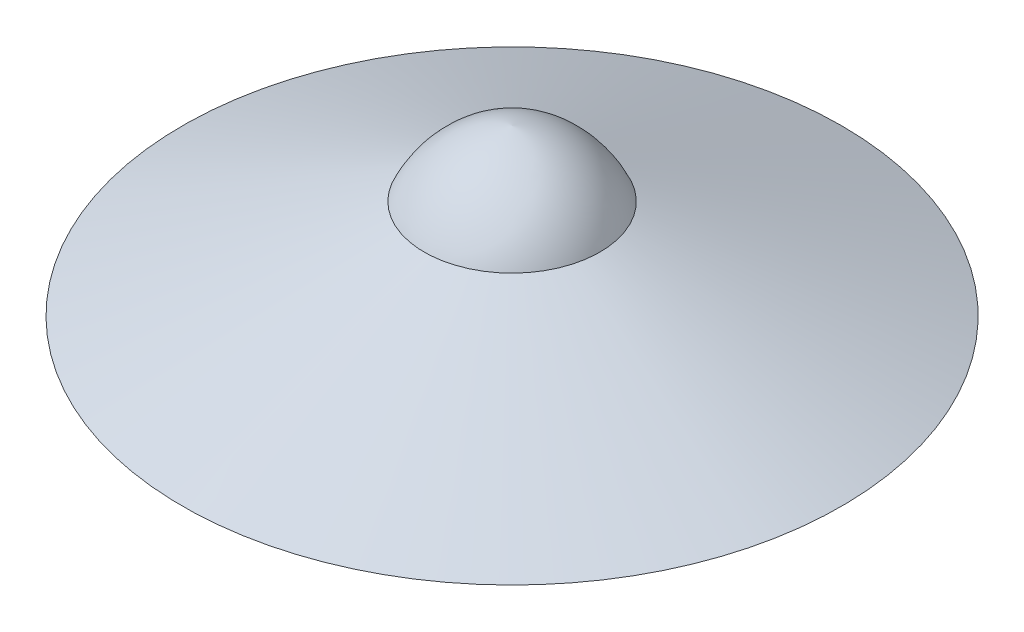
ISO-10303-21;
HEADER;
FILE_DESCRIPTION(('STEP AP214'),'2;1');
FILE_NAME('part.step','',(''),(''),'','','');
FILE_SCHEMA(('AUTOMOTIVE_DESIGN { 1 0 10303 214 1 1 1 1 }'));
ENDSEC;
DATA;
#1=APPLICATION_CONTEXT('core data for automotive mechanical design processes');
#2=APPLICATION_PROTOCOL_DEFINITION('international standard','automotive_design',2000,#1);
#3=PRODUCT_CONTEXT('',#1,'mechanical');
#4=PRODUCT('Part','Part','',(#3));
#5=PRODUCT_RELATED_PRODUCT_CATEGORY('part','',(#4));
#6=PRODUCT_DEFINITION_FORMATION('','',#4);
#7=PRODUCT_DEFINITION_CONTEXT('part definition',#1,'design');
#8=PRODUCT_DEFINITION('design','',#6,#7);
#9=PRODUCT_DEFINITION_SHAPE('','',#8);
#10=(LENGTH_UNIT() NAMED_UNIT(*) SI_UNIT(.MILLI.,.METRE.));
#11=(NAMED_UNIT(*) PLANE_ANGLE_UNIT() SI_UNIT($,.RADIAN.));
#12=(NAMED_UNIT(*) SI_UNIT($,.STERADIAN.) SOLID_ANGLE_UNIT());
#13=UNCERTAINTY_MEASURE_WITH_UNIT(LENGTH_MEASURE(1.E-05),#10,'distance_accuracy_value','');
#14=(GEOMETRIC_REPRESENTATION_CONTEXT(3) GLOBAL_UNCERTAINTY_ASSIGNED_CONTEXT((#13)) GLOBAL_UNIT_ASSIGNED_CONTEXT((#10,
#11,#12)) REPRESENTATION_CONTEXT('',''));
#15=CARTESIAN_POINT('',(0.,0.,0.));
#16=DIRECTION('',(0.,0.,1.));
#17=DIRECTION('',(1.,0.,0.));
#18=AXIS2_PLACEMENT_3D('',#15,#16,#17);
#19=CARTESIAN_POINT('',(0.,0.,0.));
#20=DIRECTION('',(0.,-1.,0.));
#21=DIRECTION('',(0.,0.,-1.));
#22=AXIS2_PLACEMENT_3D('',#19,#20,#21);
#23=PLANE('',#22);
#24=CARTESIAN_POINT('',(0.,0.,0.));
#25=DIRECTION('',(0.,-1.,0.));
#26=DIRECTION('',(0.,0.,-1.));
#27=AXIS2_PLACEMENT_3D('',#24,#25,#26);
#28=CIRCLE('',#27,6.);
#29=CARTESIAN_POINT('',(0.,0.,-6.));
#30=VERTEX_POINT('',#29);
#31=EDGE_CURVE('E11',#30,#30,#28,.T.);
#32=ORIENTED_EDGE('',*,*,#31,.T.);
#33=EDGE_LOOP('',(#32));
#34=FACE_BOUND('',#33,.T.);
#35=ADVANCED_FACE('F37',(#34),#23,.T.);
#36=CARTESIAN_POINT('',(0.,0.,0.));
#37=DIRECTION('',(0.,-1.,0.));
#38=DIRECTION('',(0.,0.,-1.));
#39=AXIS2_PLACEMENT_3D('',#36,#37,#38);
#40=CONICAL_SURFACE('',#39,6.,1.1813538519985);
#41=CARTESIAN_POINT('',(0.,1.80595603029328,0.));
#42=DIRECTION('',(0.,-1.,0.));
#43=DIRECTION('',(0.,0.,-1.));
#44=AXIS2_PLACEMENT_3D('',#41,#42,#43);
#45=CIRCLE('',#44,1.59955811646913);
#46=CARTESIAN_POINT('',(0.,1.80595603029328,-1.59955811646912));
#47=VERTEX_POINT('',#46);
#48=EDGE_CURVE('E43',#47,#47,#45,.T.);
#49=CARTESIAN_POINT('',(0.,1.80595603029328,-1.59955811646912));
#50=CARTESIAN_POINT('',(0.,1.78714398831106,-1.6453960527559));
#51=CARTESIAN_POINT('',(0.,1.76833194632884,-1.69123398904268));
#52=CARTESIAN_POINT('',(0.,1.73070786236439,-1.78290986161624));
#53=CARTESIAN_POINT('',(0.,1.71189582038217,-1.82874779790302));
#54=CARTESIAN_POINT('',(0.,1.67427173641773,-1.92042367047658));
#55=CARTESIAN_POINT('',(0.,1.65545969443551,-1.96626160676336));
#56=CARTESIAN_POINT('',(0.,1.61783561047106,-2.05793747933692));
#57=CARTESIAN_POINT('',(0.,1.59902356848884,-2.1037754156237));
#58=CARTESIAN_POINT('',(0.,1.5613994845244,-2.19545128819726));
#59=CARTESIAN_POINT('',(0.,1.54258744254218,-2.24128922448404));
#60=CARTESIAN_POINT('',(0.,1.50496335857773,-2.3329650970576));
#61=CARTESIAN_POINT('',(0.,1.48615131659551,-2.37880303334438));
#62=CARTESIAN_POINT('',(0.,1.44852723263107,-2.47047890591794));
#63=CARTESIAN_POINT('',(0.,1.42971519064885,-2.51631684220472));
#64=CARTESIAN_POINT('',(0.,1.3920911066844,-2.60799271477828));
#65=CARTESIAN_POINT('',(0.,1.37327906470218,-2.65383065106506));
#66=CARTESIAN_POINT('',(0.,1.33565498073774,-2.74550652363862));
#67=CARTESIAN_POINT('',(0.,1.31684293875552,-2.7913444599254));
#68=CARTESIAN_POINT('',(0.,1.27921885479107,-2.88302033249896));
#69=CARTESIAN_POINT('',(0.,1.26040681280885,-2.92885826878574));
#70=CARTESIAN_POINT('',(0.,1.22278272884441,-3.0205341413593));
#71=CARTESIAN_POINT('',(0.,1.20397068686219,-3.06637207764608));
#72=CARTESIAN_POINT('',(0.,1.16634660289774,-3.15804795021964));
#73=CARTESIAN_POINT('',(0.,1.14753456091552,-3.20388588650642));
#74=CARTESIAN_POINT('',(0.,1.10991047695108,-3.29556175907998));
#75=CARTESIAN_POINT('',(0.,1.09109843496886,-3.34139969536676));
#76=CARTESIAN_POINT('',(0.,1.05347435100441,-3.43307556794032));
#77=CARTESIAN_POINT('',(0.,1.03466230902219,-3.4789135042271));
#78=CARTESIAN_POINT('',(0.,0.997038225057749,-3.57058937680066));
#79=CARTESIAN_POINT('',(0.,0.978226183075527,-3.61642731308744));
#80=CARTESIAN_POINT('',(0.,0.940602099111084,-3.708103185661));
#81=CARTESIAN_POINT('',(0.,0.921790057128862,-3.75394112194778));
#82=CARTESIAN_POINT('',(0.,0.884165973164419,-3.84561699452134));
#83=CARTESIAN_POINT('',(0.,0.865353931182197,-3.89145493080812));
#84=CARTESIAN_POINT('',(0.,0.827729847217754,-3.98313080338168));
#85=CARTESIAN_POINT('',(0.,0.808917805235532,-4.02896873966846));
#86=CARTESIAN_POINT('',(0.,0.771293721271089,-4.12064461224202));
#87=CARTESIAN_POINT('',(0.,0.752481679288867,-4.1664825485288));
#88=CARTESIAN_POINT('',(0.,0.714857595324424,-4.25815842110236));
#89=CARTESIAN_POINT('',(0.,0.696045553342202,-4.30399635738914));
#90=CARTESIAN_POINT('',(0.,0.658421469377759,-4.3956722299627));
#91=CARTESIAN_POINT('',(0.,0.639609427395537,-4.44151016624948));
#92=CARTESIAN_POINT('',(0.,0.601985343431094,-4.53318603882304));
#93=CARTESIAN_POINT('',(0.,0.583173301448872,-4.57902397510982));
#94=CARTESIAN_POINT('',(0.,0.545549217484429,-4.67069984768338));
#95=CARTESIAN_POINT('',(0.,0.526737175502207,-4.71653778397016));
#96=CARTESIAN_POINT('',(0.,0.489113091537764,-4.80821365654372));
#97=CARTESIAN_POINT('',(0.,0.470301049555542,-4.8540515928305));
#98=CARTESIAN_POINT('',(0.,0.432676965591099,-4.94572746540406));
#99=CARTESIAN_POINT('',(0.,0.413864923608877,-4.99156540169084));
#100=CARTESIAN_POINT('',(0.,0.376240839644434,-5.0832412742644));
#101=CARTESIAN_POINT('',(0.,0.357428797662212,-5.12907921055118));
#102=CARTESIAN_POINT('',(0.,0.319804713697769,-5.22075508312474));
#103=CARTESIAN_POINT('',(0.,0.300992671715547,-5.26659301941152));
#104=CARTESIAN_POINT('',(0.,0.263368587751104,-5.35826889198508));
#105=CARTESIAN_POINT('',(0.,0.244556545768882,-5.40410682827186));
#106=CARTESIAN_POINT('',(0.,0.206932461804438,-5.49578270084542));
#107=CARTESIAN_POINT('',(0.,0.188120419822217,-5.5416206371322));
#108=CARTESIAN_POINT('',(0.,0.150496335857774,-5.63329650970576));
#109=CARTESIAN_POINT('',(0.,0.131684293875552,-5.67913444599254));
#110=CARTESIAN_POINT('',(0.,0.0940602099111084,-5.7708103185661));
#111=CARTESIAN_POINT('',(0.,0.0752481679288867,-5.81664825485288));
#112=CARTESIAN_POINT('',(0.,0.0376240839644434,-5.90832412742644));
#113=CARTESIAN_POINT('',(0.,0.0188120419822217,-5.95416206371322));
#114=CARTESIAN_POINT('',(0.,0.,-6.));
#115=B_SPLINE_CURVE_WITH_KNOTS('',3,(#49,#50,#51,#52,#53,#54,#55,#56,#57,#58,#59,#60,#61,#62,
#63,#64,#65,#66,#67,#68,#69,#70,#71,#72,#73,#74,#75,#76,#77,#78,#79,#80,#81,#82,#83,#84,#85,#86,
#87,#88,#89,#90,#91,#92,#93,#94,#95,#96,#97,#98,#99,#100,#101,#102,#103,#104,#105,#106,#107,
#108,#109,#110,#111,#112,#113,#114),.UNSPECIFIED.,.F.,.F.,(4,2,2,2,2,2,2,2,2,2,2,2,2,2,2,2,2,2,
2,2,2,2,2,2,2,2,2,2,2,2,2,2,4),(0.,0.148644152051623,0.297288304103246,0.445932456154869,
0.594576608206491,0.743220760258114,0.891864912309737,1.04050906436136,1.18915321641298,
1.33779736846461,1.48644152051623,1.63508567256785,1.78372982461947,1.9323739766711,
2.08101812872272,2.22966228077434,2.37830643282596,2.52695058487759,2.67559473692921,
2.82423888898083,2.97288304103246,3.12152719308408,3.2701713451357,3.41881549718732,
3.56745964923895,3.71610380129057,3.86474795334219,4.01339210539382,4.16203625744544,
4.31068040949706,4.45932456154868,4.60796871360031,4.75661286565193),.UNSPECIFIED.);
#116=EDGE_CURVE('BSEAM49',#47,#30,#115,.T.);
#117=ORIENTED_EDGE('',*,*,#48,.T.);
#118=ORIENTED_EDGE('',*,*,#31,.F.);
#119=ORIENTED_EDGE('',*,*,#116,.T.);
#120=ORIENTED_EDGE('',*,*,#116,.F.);
#121=EDGE_LOOP('',(#117,#119,#118,#120));
#122=FACE_BOUND('',#121,.T.);
#123=ADVANCED_FACE('F49',(#122),#40,.T.);
#124=CARTESIAN_POINT('',(0.,0.943895840097756,0.289401918990226));
#125=DIRECTION('',(-1.,0.,0.));
#126=DIRECTION('',(0.,0.,-1.));
#127=AXIS2_PLACEMENT_3D('',#124,#125,#126);
#128=CIRCLE('',#127,2.07637130279787);
#129=TRIMMED_CURVE('',#128,(PARAMETER_VALUE(-1.43096237079102)),
(PARAMETER_VALUE(1.43096237079102)),.T.,.PARAMETER.);
#130=CARTESIAN_POINT('',(0.,0.943895840097756,0.));
#131=DIRECTION('',(0.,-1.,0.));
#132=AXIS1_PLACEMENT('',#130,#131);
#133=SURFACE_OF_REVOLUTION('',#129,#132);
#134=CARTESIAN_POINT('',(0.,3.,0.));
#135=VERTEX_POINT('',#134);
#136=VERTEX_LOOP('',#135);
#137=FACE_BOUND('',#136,.T.);
#138=ORIENTED_EDGE('',*,*,#48,.F.);
#139=EDGE_LOOP('',(#138));
#140=FACE_BOUND('',#139,.T.);
#141=ADVANCED_FACE('F46',(#137,#140),#133,.T.);
#142=CLOSED_SHELL('',(#35,#123,#141));
#143=MANIFOLD_SOLID_BREP('B2',#142);
#144=ADVANCED_BREP_SHAPE_REPRESENTATION('',(#18,#143),#14);
#145=SHAPE_DEFINITION_REPRESENTATION(#9,#144);
ENDSEC;
END-ISO-10303-21;
